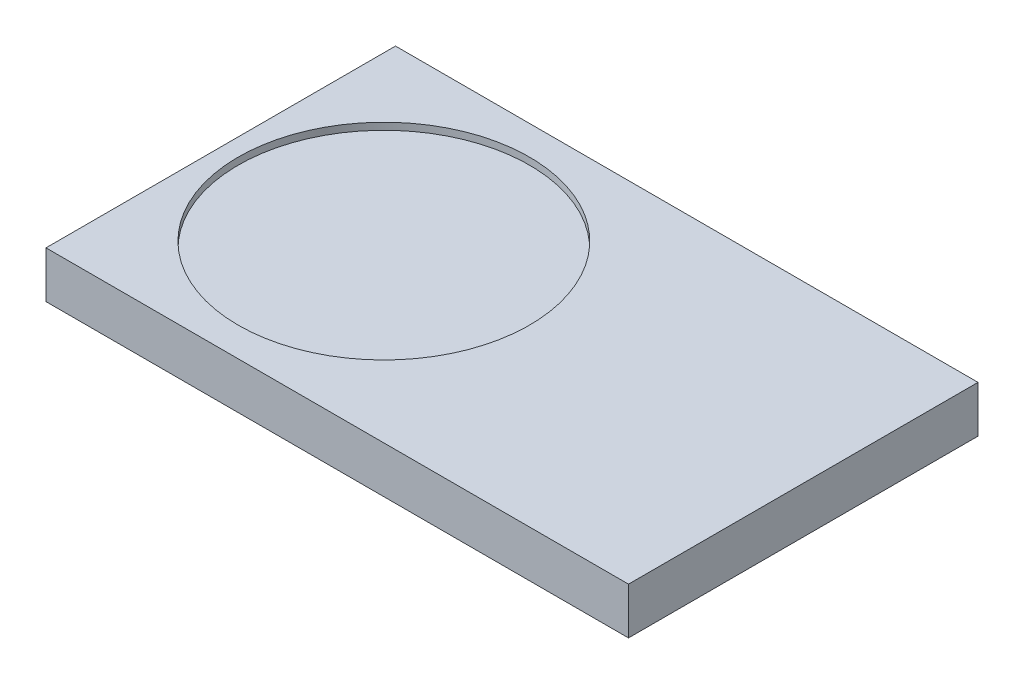
ISO-10303-21;
HEADER;
FILE_DESCRIPTION(('STEP AP214'),'2;1');
FILE_NAME('part.step','',(''),(''),'','','');
FILE_SCHEMA(('AUTOMOTIVE_DESIGN { 1 0 10303 214 1 1 1 1 }'));
ENDSEC;
DATA;
#1=APPLICATION_CONTEXT('core data for automotive mechanical design processes');
#2=APPLICATION_PROTOCOL_DEFINITION('international standard','automotive_design',2000,#1);
#3=PRODUCT_CONTEXT('',#1,'mechanical');
#4=PRODUCT('Part','Part','',(#3));
#5=PRODUCT_RELATED_PRODUCT_CATEGORY('part','',(#4));
#6=PRODUCT_DEFINITION_FORMATION('','',#4);
#7=PRODUCT_DEFINITION_CONTEXT('part definition',#1,'design');
#8=PRODUCT_DEFINITION('design','',#6,#7);
#9=PRODUCT_DEFINITION_SHAPE('','',#8);
#10=(LENGTH_UNIT() NAMED_UNIT(*) SI_UNIT(.MILLI.,.METRE.));
#11=(NAMED_UNIT(*) PLANE_ANGLE_UNIT() SI_UNIT($,.RADIAN.));
#12=(NAMED_UNIT(*) SI_UNIT($,.STERADIAN.) SOLID_ANGLE_UNIT());
#13=UNCERTAINTY_MEASURE_WITH_UNIT(LENGTH_MEASURE(1.E-05),#10,'distance_accuracy_value','');
#14=(GEOMETRIC_REPRESENTATION_CONTEXT(3) GLOBAL_UNCERTAINTY_ASSIGNED_CONTEXT((#13)) GLOBAL_UNIT_ASSIGNED_CONTEXT((#10,
#11,#12)) REPRESENTATION_CONTEXT('',''));
#15=CARTESIAN_POINT('',(0.,0.,0.));
#16=DIRECTION('',(0.,0.,1.));
#17=DIRECTION('',(1.,0.,0.));
#18=AXIS2_PLACEMENT_3D('',#15,#16,#17);
#19=CARTESIAN_POINT('',(125.,20.,75.));
#20=DIRECTION('',(-1.,0.,0.));
#21=DIRECTION('',(0.,0.,1.));
#22=AXIS2_PLACEMENT_3D('',#19,#20,#21);
#23=PLANE('',#22);
#24=DIRECTION('',(0.,0.,-1.));
#25=VECTOR('',#24,1.);
#26=CARTESIAN_POINT('',(125.,0.,75.));
#27=LINE('',#26,#25);
#28=CARTESIAN_POINT('',(125.,0.,75.));
#29=VERTEX_POINT('',#28);
#30=CARTESIAN_POINT('',(125.,0.,-75.));
#31=VERTEX_POINT('',#30);
#32=EDGE_CURVE('E80',#29,#31,#27,.T.);
#33=ORIENTED_EDGE('',*,*,#32,.T.);
#34=DIRECTION('',(0.,-1.,0.));
#35=VECTOR('',#34,1.);
#36=CARTESIAN_POINT('',(125.,20.,-75.));
#37=LINE('',#36,#35);
#38=CARTESIAN_POINT('',(125.,20.,-75.));
#39=VERTEX_POINT('',#38);
#40=EDGE_CURVE('E11',#39,#31,#37,.T.);
#41=ORIENTED_EDGE('',*,*,#40,.F.);
#42=DIRECTION('',(0.,0.,-1.));
#43=VECTOR('',#42,1.);
#44=CARTESIAN_POINT('',(125.,20.,75.));
#45=LINE('',#44,#43);
#46=CARTESIAN_POINT('',(125.,20.,75.));
#47=VERTEX_POINT('',#46);
#48=EDGE_CURVE('E68',#47,#39,#45,.T.);
#49=ORIENTED_EDGE('',*,*,#48,.F.);
#50=DIRECTION('',(0.,-1.,0.));
#51=VECTOR('',#50,1.);
#52=CARTESIAN_POINT('',(125.,20.,75.));
#53=LINE('',#52,#51);
#54=EDGE_CURVE('E76',#47,#29,#53,.T.);
#55=ORIENTED_EDGE('',*,*,#54,.T.);
#56=EDGE_LOOP('',(#33,#41,#49,#55));
#57=FACE_BOUND('',#56,.T.);
#58=ADVANCED_FACE('F17',(#57),#23,.F.);
#59=CARTESIAN_POINT('',(-125.,20.,-75.));
#60=DIRECTION('',(0.,0.,1.));
#61=DIRECTION('',(1.,0.,0.));
#62=AXIS2_PLACEMENT_3D('',#59,#60,#61);
#63=PLANE('',#62);
#64=DIRECTION('',(-1.,0.,0.));
#65=VECTOR('',#64,1.);
#66=CARTESIAN_POINT('',(-125.,0.,-75.));
#67=LINE('',#66,#65);
#68=CARTESIAN_POINT('',(-125.,0.,-75.));
#69=VERTEX_POINT('',#68);
#70=EDGE_CURVE('E72',#31,#69,#67,.T.);
#71=ORIENTED_EDGE('',*,*,#70,.T.);
#72=DIRECTION('',(0.,-1.,0.));
#73=VECTOR('',#72,1.);
#74=CARTESIAN_POINT('',(-125.,20.,-75.));
#75=LINE('',#74,#73);
#76=CARTESIAN_POINT('',(-125.,20.,-75.));
#77=VERTEX_POINT('',#76);
#78=EDGE_CURVE('E25',#77,#69,#75,.T.);
#79=ORIENTED_EDGE('',*,*,#78,.F.);
#80=DIRECTION('',(-1.,0.,0.));
#81=VECTOR('',#80,1.);
#82=CARTESIAN_POINT('',(-125.,20.,-75.));
#83=LINE('',#82,#81);
#84=EDGE_CURVE('E63',#39,#77,#83,.T.);
#85=ORIENTED_EDGE('',*,*,#84,.F.);
#86=ORIENTED_EDGE('',*,*,#40,.T.);
#87=EDGE_LOOP('',(#71,#79,#85,#86));
#88=FACE_BOUND('',#87,.T.);
#89=ADVANCED_FACE('F71',(#88),#63,.F.);
#90=CARTESIAN_POINT('',(-125.,20.,75.));
#91=DIRECTION('',(1.,0.,0.));
#92=DIRECTION('',(0.,0.,-1.));
#93=AXIS2_PLACEMENT_3D('',#90,#91,#92);
#94=PLANE('',#93);
#95=DIRECTION('',(0.,0.,1.));
#96=VECTOR('',#95,1.);
#97=CARTESIAN_POINT('',(-125.,0.,75.));
#98=LINE('',#97,#96);
#99=CARTESIAN_POINT('',(-125.,0.,75.));
#100=VERTEX_POINT('',#99);
#101=EDGE_CURVE('E50',#69,#100,#98,.T.);
#102=ORIENTED_EDGE('',*,*,#101,.T.);
#103=DIRECTION('',(0.,-1.,0.));
#104=VECTOR('',#103,1.);
#105=CARTESIAN_POINT('',(-125.,20.,75.));
#106=LINE('',#105,#104);
#107=CARTESIAN_POINT('',(-125.,20.,75.));
#108=VERTEX_POINT('',#107);
#109=EDGE_CURVE('E73',#108,#100,#106,.T.);
#110=ORIENTED_EDGE('',*,*,#109,.F.);
#111=DIRECTION('',(0.,0.,1.));
#112=VECTOR('',#111,1.);
#113=CARTESIAN_POINT('',(-125.,20.,75.));
#114=LINE('',#113,#112);
#115=EDGE_CURVE('E66',#77,#108,#114,.T.);
#116=ORIENTED_EDGE('',*,*,#115,.F.);
#117=ORIENTED_EDGE('',*,*,#78,.T.);
#118=EDGE_LOOP('',(#102,#110,#116,#117));
#119=FACE_BOUND('',#118,.T.);
#120=ADVANCED_FACE('F74',(#119),#94,.F.);
#121=CARTESIAN_POINT('',(-125.,20.,75.));
#122=DIRECTION('',(0.,0.,-1.));
#123=DIRECTION('',(-1.,0.,0.));
#124=AXIS2_PLACEMENT_3D('',#121,#122,#123);
#125=PLANE('',#124);
#126=DIRECTION('',(1.,0.,0.));
#127=VECTOR('',#126,1.);
#128=CARTESIAN_POINT('',(-125.,0.,75.));
#129=LINE('',#128,#127);
#130=EDGE_CURVE('E56',#100,#29,#129,.T.);
#131=ORIENTED_EDGE('',*,*,#130,.T.);
#132=ORIENTED_EDGE('',*,*,#54,.F.);
#133=DIRECTION('',(1.,0.,0.));
#134=VECTOR('',#133,1.);
#135=CARTESIAN_POINT('',(-125.,20.,75.));
#136=LINE('',#135,#134);
#137=EDGE_CURVE('E33',#108,#47,#136,.T.);
#138=ORIENTED_EDGE('',*,*,#137,.F.);
#139=ORIENTED_EDGE('',*,*,#109,.T.);
#140=EDGE_LOOP('',(#131,#132,#138,#139));
#141=FACE_BOUND('',#140,.T.);
#142=ADVANCED_FACE('F88',(#141),#125,.F.);
#143=CARTESIAN_POINT('',(0.,20.,0.));
#144=DIRECTION('',(0.,-1.,0.));
#145=DIRECTION('',(0.,0.,-1.));
#146=AXIS2_PLACEMENT_3D('',#143,#144,#145);
#147=PLANE('',#146);
#148=CARTESIAN_POINT('',(-55.,20.,0.));
#149=DIRECTION('',(0.,1.,0.));
#150=DIRECTION('',(0.,0.,1.));
#151=AXIS2_PLACEMENT_3D('',#148,#149,#150);
#152=CIRCLE('',#151,62.5);
#153=CARTESIAN_POINT('',(-55.,20.,62.5));
#154=VERTEX_POINT('',#153);
#155=EDGE_CURVE('E94',#154,#154,#152,.T.);
#156=ORIENTED_EDGE('',*,*,#155,.F.);
#157=EDGE_LOOP('',(#156));
#158=FACE_BOUND('',#157,.T.);
#159=ORIENTED_EDGE('',*,*,#48,.T.);
#160=ORIENTED_EDGE('',*,*,#84,.T.);
#161=ORIENTED_EDGE('',*,*,#115,.T.);
#162=ORIENTED_EDGE('',*,*,#137,.T.);
#163=EDGE_LOOP('',(#159,#160,#161,#162));
#164=FACE_BOUND('',#163,.T.);
#165=ADVANCED_FACE('F64',(#158,#164),#147,.F.);
#166=CARTESIAN_POINT('',(0.,0.,0.));
#167=DIRECTION('',(0.,-1.,0.));
#168=DIRECTION('',(0.,0.,-1.));
#169=AXIS2_PLACEMENT_3D('',#166,#167,#168);
#170=PLANE('',#169);
#171=ORIENTED_EDGE('',*,*,#32,.F.);
#172=ORIENTED_EDGE('',*,*,#130,.F.);
#173=ORIENTED_EDGE('',*,*,#101,.F.);
#174=ORIENTED_EDGE('',*,*,#70,.F.);
#175=EDGE_LOOP('',(#171,#172,#173,#174));
#176=FACE_BOUND('',#175,.T.);
#177=ADVANCED_FACE('F91',(#176),#170,.T.);
#178=CARTESIAN_POINT('',(-55.,17.,0.));
#179=DIRECTION('',(0.,1.,0.));
#180=DIRECTION('',(0.,0.,1.));
#181=AXIS2_PLACEMENT_3D('',#178,#179,#180);
#182=CYLINDRICAL_SURFACE('',#181,62.5);
#183=CARTESIAN_POINT('',(-55.,17.,0.));
#184=DIRECTION('',(0.,1.,0.));
#185=DIRECTION('',(0.,0.,1.));
#186=AXIS2_PLACEMENT_3D('',#183,#184,#185);
#187=CIRCLE('',#186,62.5);
#188=CARTESIAN_POINT('',(-55.,17.,62.5));
#189=VERTEX_POINT('',#188);
#190=EDGE_CURVE('E83',#189,#189,#187,.T.);
#191=ORIENTED_EDGE('',*,*,#190,.F.);
#192=EDGE_LOOP('',(#191));
#193=FACE_BOUND('',#192,.T.);
#194=ORIENTED_EDGE('',*,*,#155,.T.);
#195=EDGE_LOOP('',(#194));
#196=FACE_BOUND('',#195,.T.);
#197=ADVANCED_FACE('F102',(#193,#196),#182,.F.);
#198=CARTESIAN_POINT('',(-55.,17.,0.));
#199=DIRECTION('',(0.,1.,0.));
#200=DIRECTION('',(0.,0.,1.));
#201=AXIS2_PLACEMENT_3D('',#198,#199,#200);
#202=PLANE('',#201);
#203=ORIENTED_EDGE('',*,*,#190,.T.);
#204=EDGE_LOOP('',(#203));
#205=FACE_BOUND('',#204,.T.);
#206=ADVANCED_FACE('F100',(#205),#202,.T.);
#207=CLOSED_SHELL('',(#58,#89,#120,#142,#165,#177,#197,#206));
#208=MANIFOLD_SOLID_BREP('B1',#207);
#209=ADVANCED_BREP_SHAPE_REPRESENTATION('',(#18,#208),#14);
#210=SHAPE_DEFINITION_REPRESENTATION(#9,#209);
ENDSEC;
END-ISO-10303-21;
